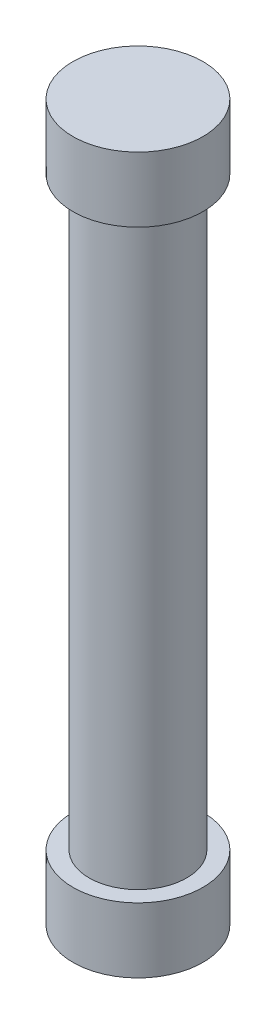
ISO-10303-21;
HEADER;
FILE_DESCRIPTION(('STEP AP214'),'2;1');
FILE_NAME('part.step','',(''),(''),'','','');
FILE_SCHEMA(('AUTOMOTIVE_DESIGN { 1 0 10303 214 1 1 1 1 }'));
ENDSEC;
DATA;
#1=APPLICATION_CONTEXT('core data for automotive mechanical design processes');
#2=APPLICATION_PROTOCOL_DEFINITION('international standard','automotive_design',2000,#1);
#3=PRODUCT_CONTEXT('',#1,'mechanical');
#4=PRODUCT('Part','Part','',(#3));
#5=PRODUCT_RELATED_PRODUCT_CATEGORY('part','',(#4));
#6=PRODUCT_DEFINITION_FORMATION('','',#4);
#7=PRODUCT_DEFINITION_CONTEXT('part definition',#1,'design');
#8=PRODUCT_DEFINITION('design','',#6,#7);
#9=PRODUCT_DEFINITION_SHAPE('','',#8);
#10=(LENGTH_UNIT() NAMED_UNIT(*) SI_UNIT(.MILLI.,.METRE.));
#11=(NAMED_UNIT(*) PLANE_ANGLE_UNIT() SI_UNIT($,.RADIAN.));
#12=(NAMED_UNIT(*) SI_UNIT($,.STERADIAN.) SOLID_ANGLE_UNIT());
#13=UNCERTAINTY_MEASURE_WITH_UNIT(LENGTH_MEASURE(1.E-05),#10,'distance_accuracy_value','');
#14=(GEOMETRIC_REPRESENTATION_CONTEXT(3) GLOBAL_UNCERTAINTY_ASSIGNED_CONTEXT((#13)) GLOBAL_UNIT_ASSIGNED_CONTEXT((#10,
#11,#12)) REPRESENTATION_CONTEXT('',''));
#15=CARTESIAN_POINT('',(0.,0.,0.));
#16=DIRECTION('',(0.,0.,1.));
#17=DIRECTION('',(1.,0.,0.));
#18=AXIS2_PLACEMENT_3D('',#15,#16,#17);
#19=CARTESIAN_POINT('',(-2.,3.96275556713113,0.));
#20=DIRECTION('',(0.,1.,0.));
#21=DIRECTION('',(-1.,0.,0.));
#22=AXIS2_PLACEMENT_3D('',#19,#20,#21);
#23=PLANE('',#22);
#24=CARTESIAN_POINT('',(0.,3.96275556713113,0.));
#25=DIRECTION('',(0.,1.,0.));
#26=DIRECTION('',(-1.,0.,0.));
#27=AXIS2_PLACEMENT_3D('',#24,#25,#26);
#28=CIRCLE('',#27,2.);
#29=CARTESIAN_POINT('',(-2.,3.96275556713113,0.));
#30=VERTEX_POINT('',#29);
#31=EDGE_CURVE('E64',#30,#30,#28,.T.);
#32=ORIENTED_EDGE('',*,*,#31,.T.);
#33=EDGE_LOOP('',(#32));
#34=FACE_BOUND('',#33,.T.);
#35=ADVANCED_FACE('F37',(#34),#23,.T.);
#36=CARTESIAN_POINT('',(0.,-18.0372444328689,0.));
#37=DIRECTION('',(0.,-1.,0.));
#38=DIRECTION('',(1.,0.,0.));
#39=AXIS2_PLACEMENT_3D('',#36,#37,#38);
#40=PLANE('',#39);
#41=CARTESIAN_POINT('',(0.,-18.0372444328689,0.));
#42=DIRECTION('',(0.,1.,0.));
#43=DIRECTION('',(-1.,0.,0.));
#44=AXIS2_PLACEMENT_3D('',#41,#42,#43);
#45=CIRCLE('',#44,2.);
#46=CARTESIAN_POINT('',(-2.,-18.0372444328689,0.));
#47=VERTEX_POINT('',#46);
#48=EDGE_CURVE('E10',#47,#47,#45,.T.);
#49=ORIENTED_EDGE('',*,*,#48,.F.);
#50=EDGE_LOOP('',(#49));
#51=FACE_BOUND('',#50,.T.);
#52=ADVANCED_FACE('F82',(#51),#40,.T.);
#53=CARTESIAN_POINT('',(0.,3.96275556713113,0.));
#54=DIRECTION('',(0.,1.,0.));
#55=DIRECTION('',(-1.,0.,0.));
#56=AXIS2_PLACEMENT_3D('',#53,#54,#55);
#57=CYLINDRICAL_SURFACE('',#56,2.);
#58=ORIENTED_EDGE('',*,*,#48,.T.);
#59=EDGE_LOOP('',(#58));
#60=FACE_BOUND('',#59,.T.);
#61=CARTESIAN_POINT('',(0.,-16.0372444328689,0.));
#62=DIRECTION('',(0.,1.,0.));
#63=DIRECTION('',(-1.,0.,0.));
#64=AXIS2_PLACEMENT_3D('',#61,#62,#63);
#65=CIRCLE('',#64,2.);
#66=CARTESIAN_POINT('',(-2.,-16.0372444328689,0.));
#67=VERTEX_POINT('',#66);
#68=EDGE_CURVE('E44',#67,#67,#65,.T.);
#69=ORIENTED_EDGE('',*,*,#68,.F.);
#70=EDGE_LOOP('',(#69));
#71=FACE_BOUND('',#70,.T.);
#72=ADVANCED_FACE('F86',(#60,#71),#57,.T.);
#73=CARTESIAN_POINT('',(-2.,-16.0372444328689,0.));
#74=DIRECTION('',(0.,1.,0.));
#75=DIRECTION('',(-1.,0.,0.));
#76=AXIS2_PLACEMENT_3D('',#73,#74,#75);
#77=PLANE('',#76);
#78=ORIENTED_EDGE('',*,*,#68,.T.);
#79=EDGE_LOOP('',(#78));
#80=FACE_BOUND('',#79,.T.);
#81=CARTESIAN_POINT('',(0.,-16.0372444328689,0.));
#82=DIRECTION('',(0.,1.,0.));
#83=DIRECTION('',(-1.,0.,0.));
#84=AXIS2_PLACEMENT_3D('',#81,#82,#83);
#85=CIRCLE('',#84,1.5);
#86=CARTESIAN_POINT('',(-1.5,-16.0372444328689,0.));
#87=VERTEX_POINT('',#86);
#88=EDGE_CURVE('E49',#87,#87,#85,.T.);
#89=ORIENTED_EDGE('',*,*,#88,.F.);
#90=EDGE_LOOP('',(#89));
#91=FACE_BOUND('',#90,.T.);
#92=ADVANCED_FACE('F91',(#80,#91),#77,.T.);
#93=CARTESIAN_POINT('',(0.,3.96275556713113,0.));
#94=DIRECTION('',(0.,1.,0.));
#95=DIRECTION('',(-1.,0.,0.));
#96=AXIS2_PLACEMENT_3D('',#93,#94,#95);
#97=CYLINDRICAL_SURFACE('',#96,1.5);
#98=ORIENTED_EDGE('',*,*,#88,.T.);
#99=EDGE_LOOP('',(#98));
#100=FACE_BOUND('',#99,.T.);
#101=CARTESIAN_POINT('',(0.,1.96275556713113,0.));
#102=DIRECTION('',(0.,1.,0.));
#103=DIRECTION('',(-1.,0.,0.));
#104=AXIS2_PLACEMENT_3D('',#101,#102,#103);
#105=CIRCLE('',#104,1.5);
#106=CARTESIAN_POINT('',(-1.5,1.96275556713113,0.));
#107=VERTEX_POINT('',#106);
#108=EDGE_CURVE('E54',#107,#107,#105,.T.);
#109=ORIENTED_EDGE('',*,*,#108,.F.);
#110=EDGE_LOOP('',(#109));
#111=FACE_BOUND('',#110,.T.);
#112=ADVANCED_FACE('F78',(#100,#111),#97,.T.);
#113=CARTESIAN_POINT('',(-1.5,1.96275556713113,0.));
#114=DIRECTION('',(0.,-1.,0.));
#115=DIRECTION('',(1.,0.,0.));
#116=AXIS2_PLACEMENT_3D('',#113,#114,#115);
#117=PLANE('',#116);
#118=ORIENTED_EDGE('',*,*,#108,.T.);
#119=EDGE_LOOP('',(#118));
#120=FACE_BOUND('',#119,.T.);
#121=CARTESIAN_POINT('',(0.,1.96275556713113,0.));
#122=DIRECTION('',(0.,1.,0.));
#123=DIRECTION('',(-1.,0.,0.));
#124=AXIS2_PLACEMENT_3D('',#121,#122,#123);
#125=CIRCLE('',#124,2.);
#126=CARTESIAN_POINT('',(-2.,1.96275556713113,0.));
#127=VERTEX_POINT('',#126);
#128=EDGE_CURVE('E60',#127,#127,#125,.T.);
#129=ORIENTED_EDGE('',*,*,#128,.F.);
#130=EDGE_LOOP('',(#129));
#131=FACE_BOUND('',#130,.T.);
#132=ADVANCED_FACE('F72',(#120,#131),#117,.T.);
#133=CARTESIAN_POINT('',(0.,3.96275556713113,0.));
#134=DIRECTION('',(0.,1.,0.));
#135=DIRECTION('',(-1.,0.,0.));
#136=AXIS2_PLACEMENT_3D('',#133,#134,#135);
#137=CYLINDRICAL_SURFACE('',#136,2.);
#138=ORIENTED_EDGE('',*,*,#128,.T.);
#139=EDGE_LOOP('',(#138));
#140=FACE_BOUND('',#139,.T.);
#141=ORIENTED_EDGE('',*,*,#31,.F.);
#142=EDGE_LOOP('',(#141));
#143=FACE_BOUND('',#142,.T.);
#144=ADVANCED_FACE('F70',(#140,#143),#137,.T.);
#145=CLOSED_SHELL('',(#35,#52,#72,#92,#112,#132,#144));
#146=MANIFOLD_SOLID_BREP('B2',#145);
#147=ADVANCED_BREP_SHAPE_REPRESENTATION('',(#18,#146),#14);
#148=SHAPE_DEFINITION_REPRESENTATION(#9,#147);
ENDSEC;
END-ISO-10303-21;
